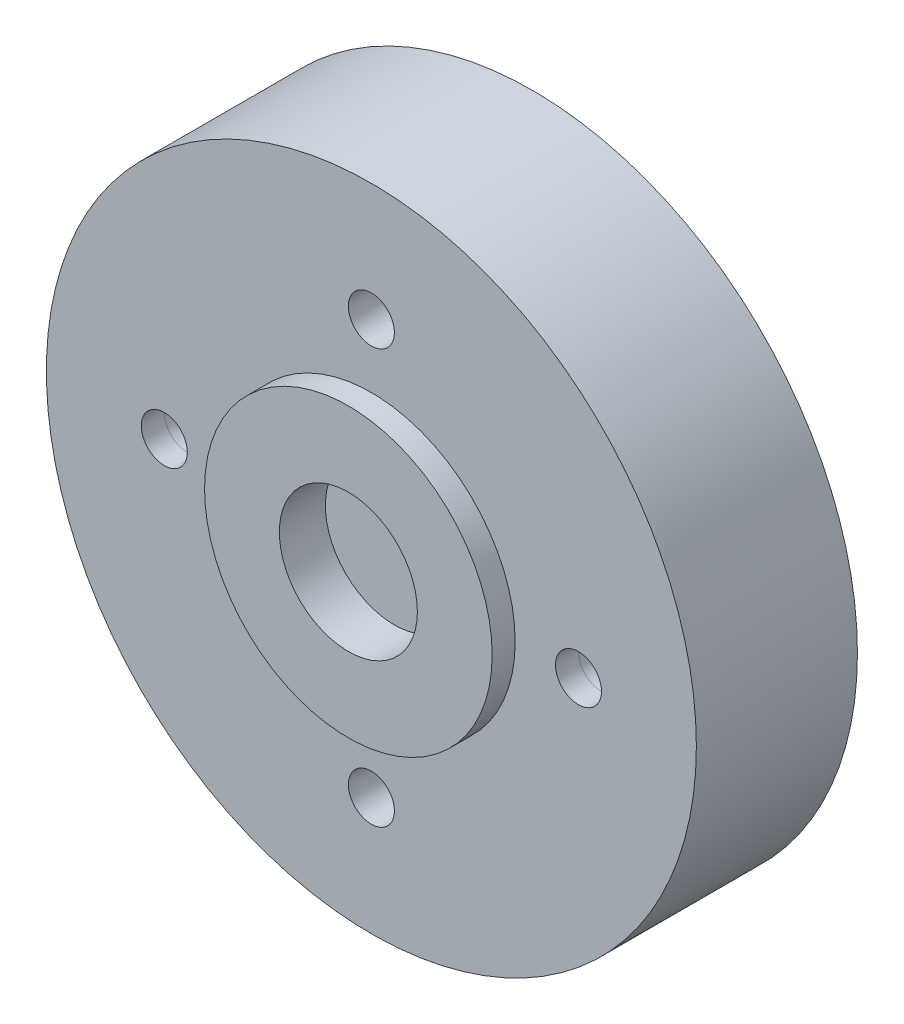
ISO-10303-21;
HEADER;
FILE_DESCRIPTION(('STEP AP214'),'2;1');
FILE_NAME('part.step','',(''),(''),'','','');
FILE_SCHEMA(('AUTOMOTIVE_DESIGN { 1 0 10303 214 1 1 1 1 }'));
ENDSEC;
DATA;
#1=APPLICATION_CONTEXT('core data for automotive mechanical design processes');
#2=APPLICATION_PROTOCOL_DEFINITION('international standard','automotive_design',2000,#1);
#3=PRODUCT_CONTEXT('',#1,'mechanical');
#4=PRODUCT('Part','Part','',(#3));
#5=PRODUCT_RELATED_PRODUCT_CATEGORY('part','',(#4));
#6=PRODUCT_DEFINITION_FORMATION('','',#4);
#7=PRODUCT_DEFINITION_CONTEXT('part definition',#1,'design');
#8=PRODUCT_DEFINITION('design','',#6,#7);
#9=PRODUCT_DEFINITION_SHAPE('','',#8);
#10=(LENGTH_UNIT() NAMED_UNIT(*) SI_UNIT(.MILLI.,.METRE.));
#11=(NAMED_UNIT(*) PLANE_ANGLE_UNIT() SI_UNIT($,.RADIAN.));
#12=(NAMED_UNIT(*) SI_UNIT($,.STERADIAN.) SOLID_ANGLE_UNIT());
#13=UNCERTAINTY_MEASURE_WITH_UNIT(LENGTH_MEASURE(1.E-05),#10,'distance_accuracy_value','');
#14=(GEOMETRIC_REPRESENTATION_CONTEXT(3) GLOBAL_UNCERTAINTY_ASSIGNED_CONTEXT((#13)) GLOBAL_UNIT_ASSIGNED_CONTEXT((#10,
#11,#12)) REPRESENTATION_CONTEXT('',''));
#15=CARTESIAN_POINT('',(0.,0.,0.));
#16=DIRECTION('',(0.,0.,1.));
#17=DIRECTION('',(1.,0.,0.));
#18=AXIS2_PLACEMENT_3D('',#15,#16,#17);
#19=CARTESIAN_POINT('',(-28.51,2.5,-4.));
#20=DIRECTION('',(0.,0.,1.));
#21=DIRECTION('',(1.,0.,0.));
#22=AXIS2_PLACEMENT_3D('',#19,#20,#21);
#23=PLANE('',#22);
#24=CARTESIAN_POINT('',(0.,0.,-4.));
#25=DIRECTION('',(0.,0.,1.));
#26=DIRECTION('',(1.,0.,0.));
#27=AXIS2_PLACEMENT_3D('',#24,#25,#26);
#28=CIRCLE('',#27,6.);
#29=CARTESIAN_POINT('',(-5.45435605731786,2.5,-4.));
#30=VERTEX_POINT('',#29);
#31=CARTESIAN_POINT('',(-5.45435605731786,-2.5,-4.));
#32=VERTEX_POINT('',#31);
#33=EDGE_CURVE('E85',#30,#32,#28,.T.);
#34=ORIENTED_EDGE('',*,*,#33,.T.);
#35=CARTESIAN_POINT('',(5.45435605731786,-2.5,-4.));
#36=VERTEX_POINT('',#35);
#37=EDGE_CURVE('E82',#32,#36,#28,.T.);
#38=ORIENTED_EDGE('',*,*,#37,.T.);
#39=CARTESIAN_POINT('',(5.45435605731786,2.5,-4.));
#40=VERTEX_POINT('',#39);
#41=EDGE_CURVE('E52',#36,#40,#28,.T.);
#42=ORIENTED_EDGE('',*,*,#41,.T.);
#43=EDGE_CURVE('E47',#40,#30,#28,.T.);
#44=ORIENTED_EDGE('',*,*,#43,.T.);
#45=EDGE_LOOP('',(#34,#38,#42,#44));
#46=FACE_BOUND('',#45,.T.);
#47=ADVANCED_FACE('F43',(#46),#23,.T.);
#48=CARTESIAN_POINT('',(-28.51,-27.5,-16.));
#49=DIRECTION('',(0.,0.,-1.));
#50=DIRECTION('',(-1.,0.,0.));
#51=AXIS2_PLACEMENT_3D('',#48,#49,#50);
#52=PLANE('',#51);
#53=CARTESIAN_POINT('',(0.,0.,-16.));
#54=DIRECTION('',(0.,0.,1.));
#55=DIRECTION('',(1.,0.,0.));
#56=AXIS2_PLACEMENT_3D('',#53,#54,#55);
#57=CIRCLE('',#56,28.25);
#58=CARTESIAN_POINT('',(28.25,0.,-16.));
#59=VERTEX_POINT('',#58);
#60=EDGE_CURVE('E96',#59,#59,#57,.T.);
#61=ORIENTED_EDGE('',*,*,#60,.F.);
#62=EDGE_LOOP('',(#61));
#63=FACE_BOUND('',#62,.T.);
#64=ADVANCED_FACE('F45',(#63),#52,.T.);
#65=CARTESIAN_POINT('',(-18.,0.,-5.));
#66=DIRECTION('',(0.,0.,1.));
#67=DIRECTION('',(1.,0.,0.));
#68=AXIS2_PLACEMENT_3D('',#65,#66,#67);
#69=PLANE('',#68);
#70=CARTESIAN_POINT('',(-18.,0.,-5.));
#71=DIRECTION('',(0.,0.,1.));
#72=DIRECTION('',(1.,0.,0.));
#73=AXIS2_PLACEMENT_3D('',#70,#71,#72);
#74=CIRCLE('',#73,2.);
#75=CARTESIAN_POINT('',(-16.,0.,-5.));
#76=VERTEX_POINT('',#75);
#77=EDGE_CURVE('E86',#76,#76,#74,.T.);
#78=ORIENTED_EDGE('',*,*,#77,.T.);
#79=EDGE_LOOP('',(#78));
#80=FACE_BOUND('',#79,.T.);
#81=ADVANCED_FACE('F174',(#80),#69,.T.);
#82=CARTESIAN_POINT('',(-18.,0.,-5.));
#83=DIRECTION('',(0.,0.,1.));
#84=DIRECTION('',(1.,0.,0.));
#85=AXIS2_PLACEMENT_3D('',#82,#83,#84);
#86=CYLINDRICAL_SURFACE('',#85,2.);
#87=ORIENTED_EDGE('',*,*,#77,.F.);
#88=EDGE_LOOP('',(#87));
#89=FACE_BOUND('',#88,.T.);
#90=CARTESIAN_POINT('',(-18.,0.,-4.));
#91=DIRECTION('',(0.,0.,1.));
#92=DIRECTION('',(1.,0.,0.));
#93=AXIS2_PLACEMENT_3D('',#90,#91,#92);
#94=CIRCLE('',#93,2.);
#95=CARTESIAN_POINT('',(-16.,0.,-4.));
#96=VERTEX_POINT('',#95);
#97=EDGE_CURVE('E134',#96,#96,#94,.F.);
#98=ORIENTED_EDGE('',*,*,#97,.F.);
#99=EDGE_LOOP('',(#98));
#100=FACE_BOUND('',#99,.T.);
#101=ADVANCED_FACE('F155',(#89,#100),#86,.F.);
#102=CARTESIAN_POINT('',(18.,0.,-5.));
#103=DIRECTION('',(0.,0.,1.));
#104=DIRECTION('',(1.,0.,0.));
#105=AXIS2_PLACEMENT_3D('',#102,#103,#104);
#106=PLANE('',#105);
#107=CARTESIAN_POINT('',(18.,0.,-5.));
#108=DIRECTION('',(0.,0.,1.));
#109=DIRECTION('',(1.,0.,0.));
#110=AXIS2_PLACEMENT_3D('',#107,#108,#109);
#111=CIRCLE('',#110,2.);
#112=CARTESIAN_POINT('',(20.,0.,-5.));
#113=VERTEX_POINT('',#112);
#114=EDGE_CURVE('E104',#113,#113,#111,.T.);
#115=ORIENTED_EDGE('',*,*,#114,.T.);
#116=EDGE_LOOP('',(#115));
#117=FACE_BOUND('',#116,.T.);
#118=ADVANCED_FACE('F171',(#117),#106,.T.);
#119=CARTESIAN_POINT('',(18.,0.,-5.));
#120=DIRECTION('',(0.,0.,1.));
#121=DIRECTION('',(1.,0.,0.));
#122=AXIS2_PLACEMENT_3D('',#119,#120,#121);
#123=CYLINDRICAL_SURFACE('',#122,2.);
#124=ORIENTED_EDGE('',*,*,#114,.F.);
#125=EDGE_LOOP('',(#124));
#126=FACE_BOUND('',#125,.T.);
#127=CARTESIAN_POINT('',(18.,0.,-4.));
#128=DIRECTION('',(0.,0.,1.));
#129=DIRECTION('',(1.,0.,0.));
#130=AXIS2_PLACEMENT_3D('',#127,#128,#129);
#131=CIRCLE('',#130,2.);
#132=CARTESIAN_POINT('',(20.,0.,-4.));
#133=VERTEX_POINT('',#132);
#134=EDGE_CURVE('E131',#133,#133,#131,.F.);
#135=ORIENTED_EDGE('',*,*,#134,.F.);
#136=EDGE_LOOP('',(#135));
#137=FACE_BOUND('',#136,.T.);
#138=ADVANCED_FACE('F161',(#126,#137),#123,.F.);
#139=CARTESIAN_POINT('',(0.,-18.,-5.));
#140=DIRECTION('',(0.,0.,1.));
#141=DIRECTION('',(1.,0.,0.));
#142=AXIS2_PLACEMENT_3D('',#139,#140,#141);
#143=PLANE('',#142);
#144=CARTESIAN_POINT('',(0.,-18.,-5.));
#145=DIRECTION('',(0.,0.,1.));
#146=DIRECTION('',(1.,0.,0.));
#147=AXIS2_PLACEMENT_3D('',#144,#145,#146);
#148=CIRCLE('',#147,2.);
#149=CARTESIAN_POINT('',(2.,-18.,-5.));
#150=VERTEX_POINT('',#149);
#151=EDGE_CURVE('E93',#150,#150,#148,.T.);
#152=ORIENTED_EDGE('',*,*,#151,.T.);
#153=EDGE_LOOP('',(#152));
#154=FACE_BOUND('',#153,.T.);
#155=ADVANCED_FACE('F158',(#154),#143,.T.);
#156=CARTESIAN_POINT('',(0.,18.,-5.));
#157=DIRECTION('',(0.,0.,1.));
#158=DIRECTION('',(1.,0.,0.));
#159=AXIS2_PLACEMENT_3D('',#156,#157,#158);
#160=PLANE('',#159);
#161=CARTESIAN_POINT('',(0.,18.,-5.));
#162=DIRECTION('',(0.,0.,1.));
#163=DIRECTION('',(1.,0.,0.));
#164=AXIS2_PLACEMENT_3D('',#161,#162,#163);
#165=CIRCLE('',#164,2.);
#166=CARTESIAN_POINT('',(2.,18.,-5.));
#167=VERTEX_POINT('',#166);
#168=EDGE_CURVE('E113',#167,#167,#165,.T.);
#169=ORIENTED_EDGE('',*,*,#168,.T.);
#170=EDGE_LOOP('',(#169));
#171=FACE_BOUND('',#170,.T.);
#172=ADVANCED_FACE('F160',(#171),#160,.T.);
#173=CARTESIAN_POINT('',(0.,0.,94.0086439358806));
#174=DIRECTION('',(0.,0.,1.));
#175=DIRECTION('',(1.,0.,0.));
#176=AXIS2_PLACEMENT_3D('',#173,#174,#175);
#177=CYLINDRICAL_SURFACE('',#176,12.5);
#178=CARTESIAN_POINT('',(0.,0.,0.));
#179=DIRECTION('',(0.,0.,1.));
#180=DIRECTION('',(1.,0.,0.));
#181=AXIS2_PLACEMENT_3D('',#178,#179,#180);
#182=CIRCLE('',#181,12.5);
#183=CARTESIAN_POINT('',(12.5,0.,0.));
#184=VERTEX_POINT('',#183);
#185=EDGE_CURVE('E126',#184,#184,#182,.T.);
#186=ORIENTED_EDGE('',*,*,#185,.F.);
#187=EDGE_LOOP('',(#186));
#188=FACE_BOUND('',#187,.T.);
#189=CARTESIAN_POINT('',(0.,0.,-2.));
#190=DIRECTION('',(0.,0.,1.));
#191=DIRECTION('',(1.,0.,0.));
#192=AXIS2_PLACEMENT_3D('',#189,#190,#191);
#193=CIRCLE('',#192,12.5);
#194=CARTESIAN_POINT('',(12.5,0.,-2.));
#195=VERTEX_POINT('',#194);
#196=EDGE_CURVE('E122',#195,#195,#193,.T.);
#197=ORIENTED_EDGE('',*,*,#196,.T.);
#198=EDGE_LOOP('',(#197));
#199=FACE_BOUND('',#198,.T.);
#200=ADVANCED_FACE('F169',(#188,#199),#177,.T.);
#201=CARTESIAN_POINT('',(0.,-18.,-5.));
#202=DIRECTION('',(0.,0.,1.));
#203=DIRECTION('',(1.,0.,0.));
#204=AXIS2_PLACEMENT_3D('',#201,#202,#203);
#205=CYLINDRICAL_SURFACE('',#204,2.);
#206=ORIENTED_EDGE('',*,*,#151,.F.);
#207=EDGE_LOOP('',(#206));
#208=FACE_BOUND('',#207,.T.);
#209=CARTESIAN_POINT('',(0.,-18.,-2.));
#210=DIRECTION('',(0.,0.,1.));
#211=DIRECTION('',(1.,0.,0.));
#212=AXIS2_PLACEMENT_3D('',#209,#210,#211);
#213=CIRCLE('',#212,2.);
#214=CARTESIAN_POINT('',(2.,-18.,-2.));
#215=VERTEX_POINT('',#214);
#216=EDGE_CURVE('E101',#215,#215,#213,.T.);
#217=ORIENTED_EDGE('',*,*,#216,.T.);
#218=EDGE_LOOP('',(#217));
#219=FACE_BOUND('',#218,.T.);
#220=ADVANCED_FACE('F176',(#208,#219),#205,.F.);
#221=CARTESIAN_POINT('',(0.,18.,-5.));
#222=DIRECTION('',(0.,0.,1.));
#223=DIRECTION('',(1.,0.,0.));
#224=AXIS2_PLACEMENT_3D('',#221,#222,#223);
#225=CYLINDRICAL_SURFACE('',#224,2.);
#226=ORIENTED_EDGE('',*,*,#168,.F.);
#227=EDGE_LOOP('',(#226));
#228=FACE_BOUND('',#227,.T.);
#229=CARTESIAN_POINT('',(0.,18.,-2.));
#230=DIRECTION('',(0.,0.,1.));
#231=DIRECTION('',(1.,0.,0.));
#232=AXIS2_PLACEMENT_3D('',#229,#230,#231);
#233=CIRCLE('',#232,2.);
#234=CARTESIAN_POINT('',(2.,18.,-2.));
#235=VERTEX_POINT('',#234);
#236=EDGE_CURVE('E110',#235,#235,#233,.T.);
#237=ORIENTED_EDGE('',*,*,#236,.T.);
#238=EDGE_LOOP('',(#237));
#239=FACE_BOUND('',#238,.T.);
#240=ADVANCED_FACE('F179',(#228,#239),#225,.F.);
#241=CARTESIAN_POINT('',(0.,12.5,-2.));
#242=DIRECTION('',(0.,0.,-1.));
#243=DIRECTION('',(-1.,0.,0.));
#244=AXIS2_PLACEMENT_3D('',#241,#242,#243);
#245=PLANE('',#244);
#246=ORIENTED_EDGE('',*,*,#236,.F.);
#247=EDGE_LOOP('',(#246));
#248=FACE_BOUND('',#247,.T.);
#249=CARTESIAN_POINT('',(18.,0.,-2.));
#250=DIRECTION('',(0.,0.,1.));
#251=DIRECTION('',(1.,0.,0.));
#252=AXIS2_PLACEMENT_3D('',#249,#250,#251);
#253=CIRCLE('',#252,2.);
#254=CARTESIAN_POINT('',(20.,0.,-2.));
#255=VERTEX_POINT('',#254);
#256=EDGE_CURVE('E107',#255,#255,#253,.T.);
#257=ORIENTED_EDGE('',*,*,#256,.F.);
#258=EDGE_LOOP('',(#257));
#259=FACE_BOUND('',#258,.T.);
#260=ORIENTED_EDGE('',*,*,#216,.F.);
#261=EDGE_LOOP('',(#260));
#262=FACE_BOUND('',#261,.T.);
#263=CARTESIAN_POINT('',(-18.,0.,-2.));
#264=DIRECTION('',(0.,0.,1.));
#265=DIRECTION('',(1.,0.,0.));
#266=AXIS2_PLACEMENT_3D('',#263,#264,#265);
#267=CIRCLE('',#266,2.);
#268=CARTESIAN_POINT('',(-16.,0.,-2.));
#269=VERTEX_POINT('',#268);
#270=EDGE_CURVE('E88',#269,#269,#267,.T.);
#271=ORIENTED_EDGE('',*,*,#270,.F.);
#272=EDGE_LOOP('',(#271));
#273=FACE_BOUND('',#272,.T.);
#274=ORIENTED_EDGE('',*,*,#196,.F.);
#275=EDGE_LOOP('',(#274));
#276=FACE_BOUND('',#275,.T.);
#277=CARTESIAN_POINT('',(0.,0.,-2.));
#278=DIRECTION('',(0.,0.,1.));
#279=DIRECTION('',(1.,0.,0.));
#280=AXIS2_PLACEMENT_3D('',#277,#278,#279);
#281=CIRCLE('',#280,28.25);
#282=CARTESIAN_POINT('',(28.25,0.,-2.));
#283=VERTEX_POINT('',#282);
#284=EDGE_CURVE('E118',#283,#283,#281,.T.);
#285=ORIENTED_EDGE('',*,*,#284,.T.);
#286=EDGE_LOOP('',(#285));
#287=FACE_BOUND('',#286,.T.);
#288=ADVANCED_FACE('F185',(#248,#259,#262,#273,#276,#287),#245,.F.);
#289=ORIENTED_EDGE('',*,*,#134,.T.);
#290=EDGE_LOOP('',(#289));
#291=FACE_BOUND('',#290,.T.);
#292=ORIENTED_EDGE('',*,*,#256,.T.);
#293=EDGE_LOOP('',(#292));
#294=FACE_BOUND('',#293,.T.);
#295=ADVANCED_FACE('F152',(#291,#294),#123,.F.);
#296=ORIENTED_EDGE('',*,*,#97,.T.);
#297=EDGE_LOOP('',(#296));
#298=FACE_BOUND('',#297,.T.);
#299=ORIENTED_EDGE('',*,*,#270,.T.);
#300=EDGE_LOOP('',(#299));
#301=FACE_BOUND('',#300,.T.);
#302=ADVANCED_FACE('F142',(#298,#301),#86,.F.);
#303=CARTESIAN_POINT('',(0.,0.,94.0086439358806));
#304=DIRECTION('',(0.,0.,1.));
#305=DIRECTION('',(1.,0.,0.));
#306=AXIS2_PLACEMENT_3D('',#303,#304,#305);
#307=CYLINDRICAL_SURFACE('',#306,28.25);
#308=CARTESIAN_POINT('',(0.,0.,-4.));
#309=DIRECTION('',(0.,0.,1.));
#310=DIRECTION('',(1.,0.,0.));
#311=AXIS2_PLACEMENT_3D('',#308,#309,#310);
#312=CIRCLE('',#311,28.25);
#313=CARTESIAN_POINT('',(-28.1391631005615,2.5,-4.));
#314=VERTEX_POINT('',#313);
#315=CARTESIAN_POINT('',(-28.1391631005615,-2.5,-4.));
#316=VERTEX_POINT('',#315);
#317=EDGE_CURVE('E137',#314,#316,#312,.T.);
#318=ORIENTED_EDGE('',*,*,#317,.F.);
#319=ORIENTED_EDGE('',*,*,#317,.T.);
#320=EDGE_LOOP('',(#318,#319));
#321=FACE_BOUND('',#320,.T.);
#322=CARTESIAN_POINT('',(28.1391631005615,-2.5,-4.));
#323=VERTEX_POINT('',#322);
#324=CARTESIAN_POINT('',(28.1391631005615,2.5,-4.));
#325=VERTEX_POINT('',#324);
#326=EDGE_CURVE('E57',#323,#325,#312,.T.);
#327=ORIENTED_EDGE('',*,*,#326,.F.);
#328=ORIENTED_EDGE('',*,*,#326,.T.);
#329=EDGE_LOOP('',(#327,#328));
#330=FACE_BOUND('',#329,.T.);
#331=ORIENTED_EDGE('',*,*,#284,.F.);
#332=EDGE_LOOP('',(#331));
#333=FACE_BOUND('',#332,.T.);
#334=ORIENTED_EDGE('',*,*,#60,.T.);
#335=EDGE_LOOP('',(#334));
#336=FACE_BOUND('',#335,.T.);
#337=ADVANCED_FACE('F139',(#321,#330,#333,#336),#307,.T.);
#338=CARTESIAN_POINT('',(0.,0.,0.));
#339=DIRECTION('',(0.,0.,-1.));
#340=DIRECTION('',(-1.,0.,0.));
#341=AXIS2_PLACEMENT_3D('',#338,#339,#340);
#342=PLANE('',#341);
#343=CARTESIAN_POINT('',(0.,0.,0.));
#344=DIRECTION('',(0.,0.,1.));
#345=DIRECTION('',(1.,0.,0.));
#346=AXIS2_PLACEMENT_3D('',#343,#344,#345);
#347=CIRCLE('',#346,6.);
#348=CARTESIAN_POINT('',(6.,0.,0.));
#349=VERTEX_POINT('',#348);
#350=EDGE_CURVE('E11',#349,#349,#347,.T.);
#351=ORIENTED_EDGE('',*,*,#350,.F.);
#352=EDGE_LOOP('',(#351));
#353=FACE_BOUND('',#352,.T.);
#354=ORIENTED_EDGE('',*,*,#185,.T.);
#355=EDGE_LOOP('',(#354));
#356=FACE_BOUND('',#355,.T.);
#357=ADVANCED_FACE('F141',(#353,#356),#342,.F.);
#358=CARTESIAN_POINT('',(0.,0.,-4.));
#359=DIRECTION('',(0.,0.,1.));
#360=DIRECTION('',(1.,0.,0.));
#361=AXIS2_PLACEMENT_3D('',#358,#359,#360);
#362=CYLINDRICAL_SURFACE('',#361,6.);
#363=ORIENTED_EDGE('',*,*,#43,.F.);
#364=ORIENTED_EDGE('',*,*,#41,.F.);
#365=ORIENTED_EDGE('',*,*,#37,.F.);
#366=ORIENTED_EDGE('',*,*,#33,.F.);
#367=EDGE_LOOP('',(#363,#364,#365,#366));
#368=FACE_BOUND('',#367,.T.);
#369=ORIENTED_EDGE('',*,*,#350,.T.);
#370=EDGE_LOOP('',(#369));
#371=FACE_BOUND('',#370,.T.);
#372=ADVANCED_FACE('F80',(#368,#371),#362,.F.);
#373=CLOSED_SHELL('',(#47,#64,#81,#101,#118,#138,#155,#172,#200,#220,#240,#288,#295,#302,#337,
#357,#372));
#374=MANIFOLD_SOLID_BREP('B2',#373);
#375=ADVANCED_BREP_SHAPE_REPRESENTATION('',(#18,#374),#14);
#376=SHAPE_DEFINITION_REPRESENTATION(#9,#375);
ENDSEC;
END-ISO-10303-21;
